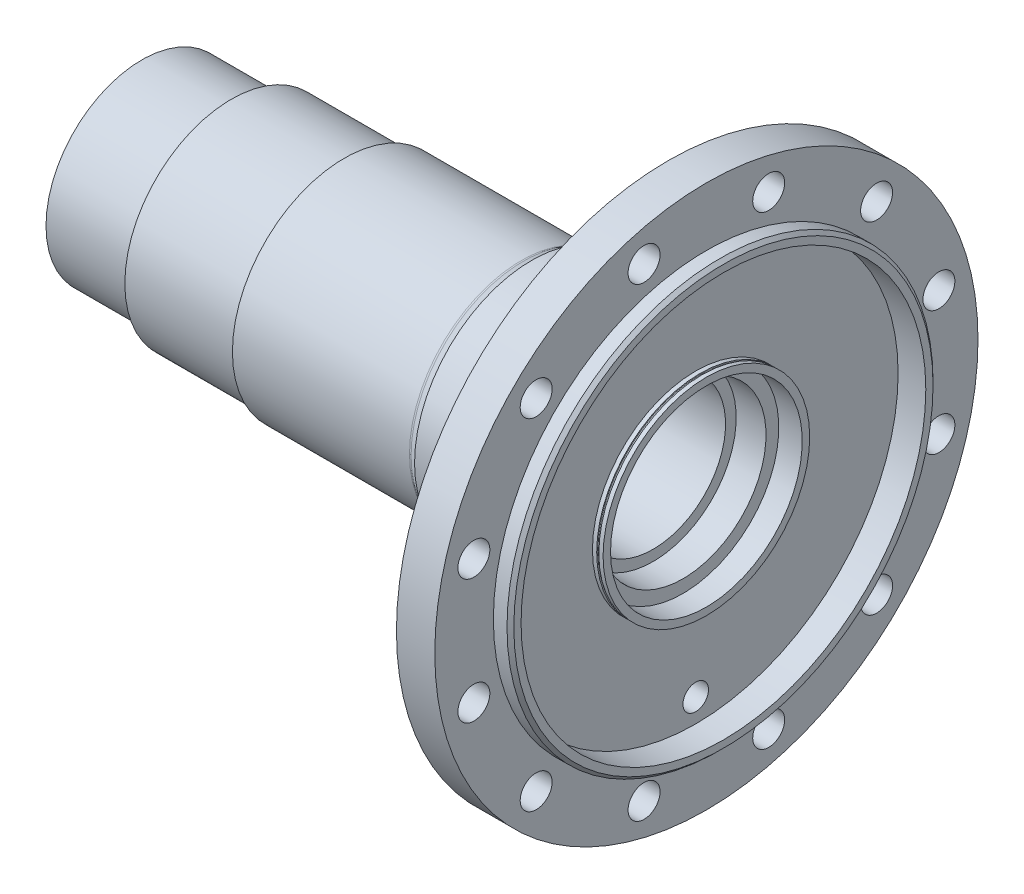
ISO-10303-21;
HEADER;
FILE_DESCRIPTION(('STEP AP214'),'2;1');
FILE_NAME('part.step','',(''),(''),'','','');
FILE_SCHEMA(('AUTOMOTIVE_DESIGN { 1 0 10303 214 1 1 1 1 }'));
ENDSEC;
DATA;
#1=APPLICATION_CONTEXT('core data for automotive mechanical design processes');
#2=APPLICATION_PROTOCOL_DEFINITION('international standard','automotive_design',2000,#1);
#3=PRODUCT_CONTEXT('',#1,'mechanical');
#4=PRODUCT('Part','Part','',(#3));
#5=PRODUCT_RELATED_PRODUCT_CATEGORY('part','',(#4));
#6=PRODUCT_DEFINITION_FORMATION('','',#4);
#7=PRODUCT_DEFINITION_CONTEXT('part definition',#1,'design');
#8=PRODUCT_DEFINITION('design','',#6,#7);
#9=PRODUCT_DEFINITION_SHAPE('','',#8);
#10=(LENGTH_UNIT() NAMED_UNIT(*) SI_UNIT(.MILLI.,.METRE.));
#11=(NAMED_UNIT(*) PLANE_ANGLE_UNIT() SI_UNIT($,.RADIAN.));
#12=(NAMED_UNIT(*) SI_UNIT($,.STERADIAN.) SOLID_ANGLE_UNIT());
#13=UNCERTAINTY_MEASURE_WITH_UNIT(LENGTH_MEASURE(1.E-05),#10,'distance_accuracy_value','');
#14=(GEOMETRIC_REPRESENTATION_CONTEXT(3) GLOBAL_UNCERTAINTY_ASSIGNED_CONTEXT((#13)) GLOBAL_UNIT_ASSIGNED_CONTEXT((#10,
#11,#12)) REPRESENTATION_CONTEXT('',''));
#15=CARTESIAN_POINT('',(0.,0.,0.));
#16=DIRECTION('',(0.,0.,1.));
#17=DIRECTION('',(1.,0.,0.));
#18=AXIS2_PLACEMENT_3D('',#15,#16,#17);
#19=CARTESIAN_POINT('',(265.,45.,0.));
#20=DIRECTION('',(1.,0.,0.));
#21=DIRECTION('',(0.,0.,-1.));
#22=AXIS2_PLACEMENT_3D('',#19,#20,#21);
#23=PLANE('',#22);
#24=CARTESIAN_POINT('',(265.,0.,0.));
#25=DIRECTION('',(-1.,0.,0.));
#26=DIRECTION('',(0.,0.,1.));
#27=AXIS2_PLACEMENT_3D('',#24,#25,#26);
#28=CIRCLE('',#27,45.);
#29=CARTESIAN_POINT('',(265.,0.,45.));
#30=VERTEX_POINT('',#29);
#31=EDGE_CURVE('E219',#30,#30,#28,.T.);
#32=ORIENTED_EDGE('',*,*,#31,.T.);
#33=EDGE_LOOP('',(#32));
#34=FACE_BOUND('',#33,.T.);
#35=CARTESIAN_POINT('',(265.,0.,0.));
#36=DIRECTION('',(-1.,0.,0.));
#37=DIRECTION('',(0.,0.,1.));
#38=AXIS2_PLACEMENT_3D('',#35,#36,#37);
#39=CIRCLE('',#38,48.5);
#40=CARTESIAN_POINT('',(265.,0.,48.5));
#41=VERTEX_POINT('',#40);
#42=EDGE_CURVE('E258',#41,#41,#39,.T.);
#43=ORIENTED_EDGE('',*,*,#42,.F.);
#44=EDGE_LOOP('',(#43));
#45=FACE_BOUND('',#44,.T.);
#46=ADVANCED_FACE('F50',(#34,#45),#23,.T.);
#47=CARTESIAN_POINT('',(0.,0.,0.));
#48=DIRECTION('',(1.,0.,0.));
#49=DIRECTION('',(0.,0.,-1.));
#50=AXIS2_PLACEMENT_3D('',#47,#48,#49);
#51=PLANE('',#50);
#52=CARTESIAN_POINT('',(0.,0.,0.));
#53=DIRECTION('',(-1.,0.,0.));
#54=DIRECTION('',(0.,0.,1.));
#55=AXIS2_PLACEMENT_3D('',#52,#53,#54);
#56=CIRCLE('',#55,31.);
#57=CARTESIAN_POINT('',(0.,0.,31.));
#58=VERTEX_POINT('',#57);
#59=EDGE_CURVE('E180',#58,#58,#56,.T.);
#60=ORIENTED_EDGE('',*,*,#59,.F.);
#61=EDGE_LOOP('',(#60));
#62=FACE_BOUND('',#61,.T.);
#63=CARTESIAN_POINT('',(0.,0.,0.));
#64=DIRECTION('',(-1.,0.,0.));
#65=DIRECTION('',(0.,0.,1.));
#66=AXIS2_PLACEMENT_3D('',#63,#64,#65);
#67=CIRCLE('',#66,45.);
#68=CARTESIAN_POINT('',(0.,0.,45.));
#69=VERTEX_POINT('',#68);
#70=EDGE_CURVE('E175',#69,#69,#67,.T.);
#71=ORIENTED_EDGE('',*,*,#70,.T.);
#72=EDGE_LOOP('',(#71));
#73=FACE_BOUND('',#72,.T.);
#74=ADVANCED_FACE('F52',(#62,#73),#51,.F.);
#75=CARTESIAN_POINT('',(273.,98.4,0.));
#76=DIRECTION('',(-1.,0.,0.));
#77=DIRECTION('',(0.,0.,1.));
#78=AXIS2_PLACEMENT_3D('',#75,#76,#77);
#79=PLANE('',#78);
#80=CARTESIAN_POINT('',(273.,0.,0.));
#81=DIRECTION('',(-1.,0.,0.));
#82=DIRECTION('',(0.,0.,1.));
#83=AXIS2_PLACEMENT_3D('',#80,#81,#82);
#84=CIRCLE('',#83,95.);
#85=CARTESIAN_POINT('',(273.,0.,95.));
#86=VERTEX_POINT('',#85);
#87=EDGE_CURVE('E224',#86,#86,#84,.T.);
#88=ORIENTED_EDGE('',*,*,#87,.T.);
#89=EDGE_LOOP('',(#88));
#90=FACE_BOUND('',#89,.T.);
#91=CARTESIAN_POINT('',(273.,0.,0.));
#92=DIRECTION('',(-1.,0.,0.));
#93=DIRECTION('',(0.,0.,1.));
#94=AXIS2_PLACEMENT_3D('',#91,#92,#93);
#95=CIRCLE('',#94,98.4);
#96=CARTESIAN_POINT('',(273.,0.,98.4));
#97=VERTEX_POINT('',#96);
#98=EDGE_CURVE('E11',#97,#97,#95,.T.);
#99=ORIENTED_EDGE('',*,*,#98,.F.);
#100=EDGE_LOOP('',(#99));
#101=FACE_BOUND('',#100,.T.);
#102=ADVANCED_FACE('F351',(#90,#101),#79,.F.);
#103=CARTESIAN_POINT('',(273.,0.,0.));
#104=DIRECTION('',(-1.,0.,0.));
#105=DIRECTION('',(0.,0.,1.));
#106=AXIS2_PLACEMENT_3D('',#103,#104,#105);
#107=CONICAL_SURFACE('',#106,98.4,0.785398163397435);
#108=CARTESIAN_POINT('',(271.4,0.,0.));
#109=DIRECTION('',(-1.,0.,0.));
#110=DIRECTION('',(0.,0.,1.));
#111=AXIS2_PLACEMENT_3D('',#108,#109,#110);
#112=CIRCLE('',#111,100.);
#113=CARTESIAN_POINT('',(271.4,0.,100.));
#114=VERTEX_POINT('',#113);
#115=EDGE_CURVE('E59',#114,#114,#112,.T.);
#116=ORIENTED_EDGE('',*,*,#115,.F.);
#117=EDGE_LOOP('',(#116));
#118=FACE_BOUND('',#117,.T.);
#119=ORIENTED_EDGE('',*,*,#98,.T.);
#120=EDGE_LOOP('',(#119));
#121=FACE_BOUND('',#120,.T.);
#122=ADVANCED_FACE('F461',(#118,#121),#107,.T.);
#123=CARTESIAN_POINT('',(0.,0.,0.));
#124=DIRECTION('',(-1.,0.,0.));
#125=DIRECTION('',(0.,0.,1.));
#126=AXIS2_PLACEMENT_3D('',#123,#124,#125);
#127=CYLINDRICAL_SURFACE('',#126,100.);
#128=CARTESIAN_POINT('',(265.,0.,0.));
#129=DIRECTION('',(-1.,0.,0.));
#130=DIRECTION('',(0.,0.,1.));
#131=AXIS2_PLACEMENT_3D('',#128,#129,#130);
#132=CIRCLE('',#131,100.);
#133=CARTESIAN_POINT('',(265.,0.,100.));
#134=VERTEX_POINT('',#133);
#135=EDGE_CURVE('E65',#134,#134,#132,.T.);
#136=ORIENTED_EDGE('',*,*,#135,.F.);
#137=EDGE_LOOP('',(#136));
#138=FACE_BOUND('',#137,.T.);
#139=ORIENTED_EDGE('',*,*,#115,.T.);
#140=EDGE_LOOP('',(#139));
#141=FACE_BOUND('',#140,.T.);
#142=ADVANCED_FACE('F457',(#138,#141),#127,.T.);
#143=CARTESIAN_POINT('',(265.,127.5,0.));
#144=DIRECTION('',(-1.,0.,0.));
#145=DIRECTION('',(0.,0.,1.));
#146=AXIS2_PLACEMENT_3D('',#143,#144,#145);
#147=PLANE('',#146);
#148=CARTESIAN_POINT('',(265.,-29.2465520965848,-109.149618370665));
#149=DIRECTION('',(-1.,0.,0.));
#150=DIRECTION('',(0.,0.,1.));
#151=AXIS2_PLACEMENT_3D('',#148,#149,#150);
#152=CIRCLE('',#151,7.50000000000001);
#153=CARTESIAN_POINT('',(265.,-29.2465520965848,-101.649618370665));
#154=VERTEX_POINT('',#153);
#155=EDGE_CURVE('E317',#154,#154,#152,.F.);
#156=ORIENTED_EDGE('',*,*,#155,.F.);
#157=EDGE_LOOP('',(#156));
#158=FACE_BOUND('',#157,.T.);
#159=CARTESIAN_POINT('',(265.,-79.9030662740799,-79.9030662740798));
#160=DIRECTION('',(-1.,0.,0.));
#161=DIRECTION('',(0.,0.,1.));
#162=AXIS2_PLACEMENT_3D('',#159,#160,#161);
#163=CIRCLE('',#162,7.49999999999999);
#164=CARTESIAN_POINT('',(265.,-79.9030662740799,-72.4030662740799));
#165=VERTEX_POINT('',#164);
#166=EDGE_CURVE('E312',#165,#165,#163,.F.);
#167=ORIENTED_EDGE('',*,*,#166,.F.);
#168=EDGE_LOOP('',(#167));
#169=FACE_BOUND('',#168,.T.);
#170=CARTESIAN_POINT('',(265.,-109.149618370665,-29.2465520965849));
#171=DIRECTION('',(-1.,0.,0.));
#172=DIRECTION('',(0.,0.,1.));
#173=AXIS2_PLACEMENT_3D('',#170,#171,#172);
#174=CIRCLE('',#173,7.5);
#175=CARTESIAN_POINT('',(265.,-109.149618370665,-21.7465520965849));
#176=VERTEX_POINT('',#175);
#177=EDGE_CURVE('E307',#176,#176,#174,.F.);
#178=ORIENTED_EDGE('',*,*,#177,.F.);
#179=EDGE_LOOP('',(#178));
#180=FACE_BOUND('',#179,.T.);
#181=CARTESIAN_POINT('',(265.,-109.149618370665,29.2465520965848));
#182=DIRECTION('',(-1.,0.,0.));
#183=DIRECTION('',(0.,0.,1.));
#184=AXIS2_PLACEMENT_3D('',#181,#182,#183);
#185=CIRCLE('',#184,7.5);
#186=CARTESIAN_POINT('',(265.,-109.149618370665,36.7465520965848));
#187=VERTEX_POINT('',#186);
#188=EDGE_CURVE('E302',#187,#187,#185,.F.);
#189=ORIENTED_EDGE('',*,*,#188,.F.);
#190=EDGE_LOOP('',(#189));
#191=FACE_BOUND('',#190,.T.);
#192=CARTESIAN_POINT('',(265.,-79.9030662740799,79.9030662740799));
#193=DIRECTION('',(-1.,0.,0.));
#194=DIRECTION('',(0.,0.,1.));
#195=AXIS2_PLACEMENT_3D('',#192,#193,#194);
#196=CIRCLE('',#195,7.50000000000001);
#197=CARTESIAN_POINT('',(265.,-79.9030662740799,87.4030662740799));
#198=VERTEX_POINT('',#197);
#199=EDGE_CURVE('E297',#198,#198,#196,.F.);
#200=ORIENTED_EDGE('',*,*,#199,.F.);
#201=EDGE_LOOP('',(#200));
#202=FACE_BOUND('',#201,.T.);
#203=CARTESIAN_POINT('',(265.,-29.2465520965848,109.149618370665));
#204=DIRECTION('',(-1.,0.,0.));
#205=DIRECTION('',(0.,0.,1.));
#206=AXIS2_PLACEMENT_3D('',#203,#204,#205);
#207=CIRCLE('',#206,7.50000000000001);
#208=CARTESIAN_POINT('',(265.,-29.2465520965848,116.649618370665));
#209=VERTEX_POINT('',#208);
#210=EDGE_CURVE('E292',#209,#209,#207,.F.);
#211=ORIENTED_EDGE('',*,*,#210,.F.);
#212=EDGE_LOOP('',(#211));
#213=FACE_BOUND('',#212,.T.);
#214=CARTESIAN_POINT('',(265.,29.2465520965849,109.149618370665));
#215=DIRECTION('',(-1.,0.,0.));
#216=DIRECTION('',(0.,0.,1.));
#217=AXIS2_PLACEMENT_3D('',#214,#215,#216);
#218=CIRCLE('',#217,7.49999999999999);
#219=CARTESIAN_POINT('',(265.,29.2465520965849,116.649618370665));
#220=VERTEX_POINT('',#219);
#221=EDGE_CURVE('E287',#220,#220,#218,.F.);
#222=ORIENTED_EDGE('',*,*,#221,.F.);
#223=EDGE_LOOP('',(#222));
#224=FACE_BOUND('',#223,.T.);
#225=CARTESIAN_POINT('',(265.,79.9030662740799,79.9030662740799));
#226=DIRECTION('',(-1.,0.,0.));
#227=DIRECTION('',(0.,0.,1.));
#228=AXIS2_PLACEMENT_3D('',#225,#226,#227);
#229=CIRCLE('',#228,7.50000000000001);
#230=CARTESIAN_POINT('',(265.,79.9030662740799,87.4030662740799));
#231=VERTEX_POINT('',#230);
#232=EDGE_CURVE('E282',#231,#231,#229,.F.);
#233=ORIENTED_EDGE('',*,*,#232,.F.);
#234=EDGE_LOOP('',(#233));
#235=FACE_BOUND('',#234,.T.);
#236=CARTESIAN_POINT('',(265.,109.149618370665,29.2465520965849));
#237=DIRECTION('',(-1.,0.,0.));
#238=DIRECTION('',(0.,0.,1.));
#239=AXIS2_PLACEMENT_3D('',#236,#237,#238);
#240=CIRCLE('',#239,7.5);
#241=CARTESIAN_POINT('',(265.,109.149618370665,36.7465520965848));
#242=VERTEX_POINT('',#241);
#243=EDGE_CURVE('E277',#242,#242,#240,.F.);
#244=ORIENTED_EDGE('',*,*,#243,.F.);
#245=EDGE_LOOP('',(#244));
#246=FACE_BOUND('',#245,.T.);
#247=CARTESIAN_POINT('',(265.,109.149618370665,-29.2465520965848));
#248=DIRECTION('',(-1.,0.,0.));
#249=DIRECTION('',(0.,0.,1.));
#250=AXIS2_PLACEMENT_3D('',#247,#248,#249);
#251=CIRCLE('',#250,7.5);
#252=CARTESIAN_POINT('',(265.,109.149618370665,-21.7465520965848));
#253=VERTEX_POINT('',#252);
#254=EDGE_CURVE('E272',#253,#253,#251,.F.);
#255=ORIENTED_EDGE('',*,*,#254,.F.);
#256=EDGE_LOOP('',(#255));
#257=FACE_BOUND('',#256,.T.);
#258=CARTESIAN_POINT('',(265.,79.9030662740799,-79.9030662740799));
#259=DIRECTION('',(-1.,0.,0.));
#260=DIRECTION('',(0.,0.,1.));
#261=AXIS2_PLACEMENT_3D('',#258,#259,#260);
#262=CIRCLE('',#261,7.49999999999999);
#263=CARTESIAN_POINT('',(265.,79.9030662740799,-72.4030662740799));
#264=VERTEX_POINT('',#263);
#265=EDGE_CURVE('E267',#264,#264,#262,.F.);
#266=ORIENTED_EDGE('',*,*,#265,.F.);
#267=EDGE_LOOP('',(#266));
#268=FACE_BOUND('',#267,.T.);
#269=CARTESIAN_POINT('',(265.,29.2465520965848,-109.149618370665));
#270=DIRECTION('',(-1.,0.,0.));
#271=DIRECTION('',(0.,0.,1.));
#272=AXIS2_PLACEMENT_3D('',#269,#270,#271);
#273=CIRCLE('',#272,7.50000000000001);
#274=CARTESIAN_POINT('',(265.,29.2465520965848,-101.649618370665));
#275=VERTEX_POINT('',#274);
#276=EDGE_CURVE('E263',#275,#275,#273,.F.);
#277=ORIENTED_EDGE('',*,*,#276,.F.);
#278=EDGE_LOOP('',(#277));
#279=FACE_BOUND('',#278,.T.);
#280=CARTESIAN_POINT('',(265.,0.,0.));
#281=DIRECTION('',(-1.,0.,0.));
#282=DIRECTION('',(0.,0.,1.));
#283=AXIS2_PLACEMENT_3D('',#280,#281,#282);
#284=CIRCLE('',#283,127.5);
#285=CARTESIAN_POINT('',(265.,0.,127.5));
#286=VERTEX_POINT('',#285);
#287=EDGE_CURVE('E82',#286,#286,#284,.T.);
#288=ORIENTED_EDGE('',*,*,#287,.F.);
#289=EDGE_LOOP('',(#288));
#290=FACE_BOUND('',#289,.T.);
#291=ORIENTED_EDGE('',*,*,#135,.T.);
#292=EDGE_LOOP('',(#291));
#293=FACE_BOUND('',#292,.T.);
#294=ADVANCED_FACE('F453',(#158,#169,#180,#191,#202,#213,#224,#235,#246,#257,#268,#279,#290,
#293),#147,.F.);
#295=CARTESIAN_POINT('',(0.,0.,0.));
#296=DIRECTION('',(-1.,0.,0.));
#297=DIRECTION('',(0.,0.,1.));
#298=AXIS2_PLACEMENT_3D('',#295,#296,#297);
#299=CYLINDRICAL_SURFACE('',#298,127.5);
#300=CARTESIAN_POINT('',(247.,0.,0.));
#301=DIRECTION('',(-1.,0.,0.));
#302=DIRECTION('',(0.,0.,1.));
#303=AXIS2_PLACEMENT_3D('',#300,#301,#302);
#304=CIRCLE('',#303,127.5);
#305=CARTESIAN_POINT('',(247.,0.,127.5));
#306=VERTEX_POINT('',#305);
#307=EDGE_CURVE('E87',#306,#306,#304,.T.);
#308=ORIENTED_EDGE('',*,*,#307,.F.);
#309=EDGE_LOOP('',(#308));
#310=FACE_BOUND('',#309,.T.);
#311=ORIENTED_EDGE('',*,*,#287,.T.);
#312=EDGE_LOOP('',(#311));
#313=FACE_BOUND('',#312,.T.);
#314=ADVANCED_FACE('F449',(#310,#313),#299,.T.);
#315=CARTESIAN_POINT('',(247.,100.,0.));
#316=DIRECTION('',(1.,0.,0.));
#317=DIRECTION('',(0.,0.,-1.));
#318=AXIS2_PLACEMENT_3D('',#315,#316,#317);
#319=PLANE('',#318);
#320=CARTESIAN_POINT('',(247.,-29.2465520965848,-109.149618370665));
#321=DIRECTION('',(1.,0.,0.));
#322=DIRECTION('',(0.,0.,-1.));
#323=AXIS2_PLACEMENT_3D('',#320,#321,#322);
#324=CIRCLE('',#323,7.50000000000001);
#325=CARTESIAN_POINT('',(247.,-29.2465520965848,-116.649618370665));
#326=VERTEX_POINT('',#325);
#327=EDGE_CURVE('E321',#326,#326,#324,.F.);
#328=ORIENTED_EDGE('',*,*,#327,.F.);
#329=EDGE_LOOP('',(#328));
#330=FACE_BOUND('',#329,.T.);
#331=CARTESIAN_POINT('',(247.,-79.9030662740799,-79.9030662740798));
#332=DIRECTION('',(1.,0.,0.));
#333=DIRECTION('',(0.,0.,-1.));
#334=AXIS2_PLACEMENT_3D('',#331,#332,#333);
#335=CIRCLE('',#334,7.49999999999999);
#336=CARTESIAN_POINT('',(247.,-79.9030662740799,-87.4030662740798));
#337=VERTEX_POINT('',#336);
#338=EDGE_CURVE('E316',#337,#337,#335,.F.);
#339=ORIENTED_EDGE('',*,*,#338,.F.);
#340=EDGE_LOOP('',(#339));
#341=FACE_BOUND('',#340,.T.);
#342=CARTESIAN_POINT('',(247.,-109.149618370665,-29.2465520965849));
#343=DIRECTION('',(1.,0.,0.));
#344=DIRECTION('',(0.,0.,-1.));
#345=AXIS2_PLACEMENT_3D('',#342,#343,#344);
#346=CIRCLE('',#345,7.5);
#347=CARTESIAN_POINT('',(247.,-109.149618370665,-36.7465520965849));
#348=VERTEX_POINT('',#347);
#349=EDGE_CURVE('E311',#348,#348,#346,.F.);
#350=ORIENTED_EDGE('',*,*,#349,.F.);
#351=EDGE_LOOP('',(#350));
#352=FACE_BOUND('',#351,.T.);
#353=CARTESIAN_POINT('',(247.,-109.149618370665,29.2465520965848));
#354=DIRECTION('',(1.,0.,0.));
#355=DIRECTION('',(0.,0.,-1.));
#356=AXIS2_PLACEMENT_3D('',#353,#354,#355);
#357=CIRCLE('',#356,7.5);
#358=CARTESIAN_POINT('',(247.,-109.149618370665,21.7465520965848));
#359=VERTEX_POINT('',#358);
#360=EDGE_CURVE('E306',#359,#359,#357,.F.);
#361=ORIENTED_EDGE('',*,*,#360,.F.);
#362=EDGE_LOOP('',(#361));
#363=FACE_BOUND('',#362,.T.);
#364=CARTESIAN_POINT('',(247.,-79.9030662740799,79.9030662740799));
#365=DIRECTION('',(1.,0.,0.));
#366=DIRECTION('',(0.,0.,-1.));
#367=AXIS2_PLACEMENT_3D('',#364,#365,#366);
#368=CIRCLE('',#367,7.50000000000001);
#369=CARTESIAN_POINT('',(247.,-79.9030662740799,72.4030662740799));
#370=VERTEX_POINT('',#369);
#371=EDGE_CURVE('E301',#370,#370,#368,.F.);
#372=ORIENTED_EDGE('',*,*,#371,.F.);
#373=EDGE_LOOP('',(#372));
#374=FACE_BOUND('',#373,.T.);
#375=CARTESIAN_POINT('',(247.,-29.2465520965848,109.149618370665));
#376=DIRECTION('',(1.,0.,0.));
#377=DIRECTION('',(0.,0.,-1.));
#378=AXIS2_PLACEMENT_3D('',#375,#376,#377);
#379=CIRCLE('',#378,7.50000000000001);
#380=CARTESIAN_POINT('',(247.,-29.2465520965848,101.649618370665));
#381=VERTEX_POINT('',#380);
#382=EDGE_CURVE('E296',#381,#381,#379,.F.);
#383=ORIENTED_EDGE('',*,*,#382,.F.);
#384=EDGE_LOOP('',(#383));
#385=FACE_BOUND('',#384,.T.);
#386=CARTESIAN_POINT('',(247.,29.2465520965849,109.149618370665));
#387=DIRECTION('',(1.,0.,0.));
#388=DIRECTION('',(0.,0.,-1.));
#389=AXIS2_PLACEMENT_3D('',#386,#387,#388);
#390=CIRCLE('',#389,7.49999999999999);
#391=CARTESIAN_POINT('',(247.,29.2465520965849,101.649618370665));
#392=VERTEX_POINT('',#391);
#393=EDGE_CURVE('E291',#392,#392,#390,.F.);
#394=ORIENTED_EDGE('',*,*,#393,.F.);
#395=EDGE_LOOP('',(#394));
#396=FACE_BOUND('',#395,.T.);
#397=CARTESIAN_POINT('',(247.,79.9030662740799,79.9030662740799));
#398=DIRECTION('',(1.,0.,0.));
#399=DIRECTION('',(0.,0.,-1.));
#400=AXIS2_PLACEMENT_3D('',#397,#398,#399);
#401=CIRCLE('',#400,7.50000000000001);
#402=CARTESIAN_POINT('',(247.,79.9030662740799,72.4030662740799));
#403=VERTEX_POINT('',#402);
#404=EDGE_CURVE('E286',#403,#403,#401,.F.);
#405=ORIENTED_EDGE('',*,*,#404,.F.);
#406=EDGE_LOOP('',(#405));
#407=FACE_BOUND('',#406,.T.);
#408=CARTESIAN_POINT('',(247.,109.149618370665,29.2465520965849));
#409=DIRECTION('',(1.,0.,0.));
#410=DIRECTION('',(0.,0.,-1.));
#411=AXIS2_PLACEMENT_3D('',#408,#409,#410);
#412=CIRCLE('',#411,7.5);
#413=CARTESIAN_POINT('',(247.,109.149618370665,21.7465520965849));
#414=VERTEX_POINT('',#413);
#415=EDGE_CURVE('E281',#414,#414,#412,.F.);
#416=ORIENTED_EDGE('',*,*,#415,.F.);
#417=EDGE_LOOP('',(#416));
#418=FACE_BOUND('',#417,.T.);
#419=CARTESIAN_POINT('',(247.,109.149618370665,-29.2465520965848));
#420=DIRECTION('',(1.,0.,0.));
#421=DIRECTION('',(0.,0.,-1.));
#422=AXIS2_PLACEMENT_3D('',#419,#420,#421);
#423=CIRCLE('',#422,7.5);
#424=CARTESIAN_POINT('',(247.,109.149618370665,-36.7465520965848));
#425=VERTEX_POINT('',#424);
#426=EDGE_CURVE('E276',#425,#425,#423,.F.);
#427=ORIENTED_EDGE('',*,*,#426,.F.);
#428=EDGE_LOOP('',(#427));
#429=FACE_BOUND('',#428,.T.);
#430=CARTESIAN_POINT('',(247.,79.9030662740799,-79.9030662740799));
#431=DIRECTION('',(1.,0.,0.));
#432=DIRECTION('',(0.,0.,-1.));
#433=AXIS2_PLACEMENT_3D('',#430,#431,#432);
#434=CIRCLE('',#433,7.49999999999999);
#435=CARTESIAN_POINT('',(247.,79.9030662740799,-87.4030662740799));
#436=VERTEX_POINT('',#435);
#437=EDGE_CURVE('E271',#436,#436,#434,.F.);
#438=ORIENTED_EDGE('',*,*,#437,.F.);
#439=EDGE_LOOP('',(#438));
#440=FACE_BOUND('',#439,.T.);
#441=CARTESIAN_POINT('',(247.,29.2465520965848,-109.149618370665));
#442=DIRECTION('',(1.,0.,0.));
#443=DIRECTION('',(0.,0.,-1.));
#444=AXIS2_PLACEMENT_3D('',#441,#442,#443);
#445=CIRCLE('',#444,7.50000000000001);
#446=CARTESIAN_POINT('',(247.,29.2465520965848,-116.649618370665));
#447=VERTEX_POINT('',#446);
#448=EDGE_CURVE('E71',#447,#447,#445,.F.);
#449=ORIENTED_EDGE('',*,*,#448,.F.);
#450=EDGE_LOOP('',(#449));
#451=FACE_BOUND('',#450,.T.);
#452=CARTESIAN_POINT('',(247.,0.,0.));
#453=DIRECTION('',(-1.,0.,0.));
#454=DIRECTION('',(0.,0.,1.));
#455=AXIS2_PLACEMENT_3D('',#452,#453,#454);
#456=CIRCLE('',#455,100.);
#457=CARTESIAN_POINT('',(247.,0.,100.));
#458=VERTEX_POINT('',#457);
#459=EDGE_CURVE('E92',#458,#458,#456,.T.);
#460=ORIENTED_EDGE('',*,*,#459,.F.);
#461=EDGE_LOOP('',(#460));
#462=FACE_BOUND('',#461,.T.);
#463=ORIENTED_EDGE('',*,*,#307,.T.);
#464=EDGE_LOOP('',(#463));
#465=FACE_BOUND('',#464,.T.);
#466=ADVANCED_FACE('F445',(#330,#341,#352,#363,#374,#385,#396,#407,#418,#429,#440,#451,#462,
#465),#319,.F.);
#467=CARTESIAN_POINT('',(0.,0.,0.));
#468=DIRECTION('',(-1.,0.,0.));
#469=DIRECTION('',(0.,0.,1.));
#470=AXIS2_PLACEMENT_3D('',#467,#468,#469);
#471=CYLINDRICAL_SURFACE('',#470,100.);
#472=CARTESIAN_POINT('',(239.,0.,0.));
#473=DIRECTION('',(-1.,0.,0.));
#474=DIRECTION('',(0.,0.,1.));
#475=AXIS2_PLACEMENT_3D('',#472,#473,#474);
#476=CIRCLE('',#475,100.);
#477=CARTESIAN_POINT('',(239.,0.,100.));
#478=VERTEX_POINT('',#477);
#479=EDGE_CURVE('E100',#478,#478,#476,.T.);
#480=ORIENTED_EDGE('',*,*,#479,.F.);
#481=EDGE_LOOP('',(#480));
#482=FACE_BOUND('',#481,.T.);
#483=ORIENTED_EDGE('',*,*,#459,.T.);
#484=EDGE_LOOP('',(#483));
#485=FACE_BOUND('',#484,.T.);
#486=ADVANCED_FACE('F441',(#482,#485),#471,.T.);
#487=CARTESIAN_POINT('',(239.,64.5,0.));
#488=DIRECTION('',(1.,0.,0.));
#489=DIRECTION('',(0.,0.,-1.));
#490=AXIS2_PLACEMENT_3D('',#487,#488,#489);
#491=PLANE('',#490);
#492=CARTESIAN_POINT('',(239.,-84.,0.));
#493=DIRECTION('',(1.,0.,0.));
#494=DIRECTION('',(0.,0.,-1.));
#495=AXIS2_PLACEMENT_3D('',#492,#493,#494);
#496=CIRCLE('',#495,6.);
#497=CARTESIAN_POINT('',(239.,-84.,-6.));
#498=VERTEX_POINT('',#497);
#499=EDGE_CURVE('E322',#498,#498,#496,.F.);
#500=ORIENTED_EDGE('',*,*,#499,.F.);
#501=EDGE_LOOP('',(#500));
#502=FACE_BOUND('',#501,.T.);
#503=CARTESIAN_POINT('',(239.,0.,0.));
#504=DIRECTION('',(-1.,0.,0.));
#505=DIRECTION('',(0.,0.,1.));
#506=AXIS2_PLACEMENT_3D('',#503,#504,#505);
#507=CIRCLE('',#506,64.5);
#508=CARTESIAN_POINT('',(239.,0.,64.5));
#509=VERTEX_POINT('',#508);
#510=EDGE_CURVE('E104',#509,#509,#507,.T.);
#511=ORIENTED_EDGE('',*,*,#510,.F.);
#512=EDGE_LOOP('',(#511));
#513=FACE_BOUND('',#512,.T.);
#514=ORIENTED_EDGE('',*,*,#479,.T.);
#515=EDGE_LOOP('',(#514));
#516=FACE_BOUND('',#515,.T.);
#517=ADVANCED_FACE('F437',(#502,#513,#516),#491,.F.);
#518=CARTESIAN_POINT('',(237.,0.,0.));
#519=DIRECTION('',(-1.,0.,0.));
#520=DIRECTION('',(0.,0.,1.));
#521=AXIS2_PLACEMENT_3D('',#518,#519,#520);
#522=TOROIDAL_SURFACE('',#521,64.5,1.99999999999997);
#523=CARTESIAN_POINT('',(237.,0.,0.));
#524=DIRECTION('',(-1.,0.,0.));
#525=DIRECTION('',(0.,0.,1.));
#526=AXIS2_PLACEMENT_3D('',#523,#524,#525);
#527=CIRCLE('',#526,62.5);
#528=CARTESIAN_POINT('',(237.,0.,62.5));
#529=VERTEX_POINT('',#528);
#530=EDGE_CURVE('E109',#529,#529,#527,.T.);
#531=ORIENTED_EDGE('',*,*,#530,.F.);
#532=EDGE_LOOP('',(#531));
#533=FACE_BOUND('',#532,.T.);
#534=ORIENTED_EDGE('',*,*,#510,.T.);
#535=EDGE_LOOP('',(#534));
#536=FACE_BOUND('',#535,.T.);
#537=ADVANCED_FACE('F433',(#533,#536),#522,.F.);
#538=CARTESIAN_POINT('',(0.,0.,0.));
#539=DIRECTION('',(-1.,0.,0.));
#540=DIRECTION('',(0.,0.,1.));
#541=AXIS2_PLACEMENT_3D('',#538,#539,#540);
#542=CYLINDRICAL_SURFACE('',#541,62.5);
#543=CARTESIAN_POINT('',(218.,0.,0.));
#544=DIRECTION('',(-1.,0.,0.));
#545=DIRECTION('',(0.,0.,1.));
#546=AXIS2_PLACEMENT_3D('',#543,#544,#545);
#547=CIRCLE('',#546,62.5);
#548=CARTESIAN_POINT('',(218.,0.,62.5));
#549=VERTEX_POINT('',#548);
#550=EDGE_CURVE('E114',#549,#549,#547,.T.);
#551=ORIENTED_EDGE('',*,*,#550,.F.);
#552=EDGE_LOOP('',(#551));
#553=FACE_BOUND('',#552,.T.);
#554=ORIENTED_EDGE('',*,*,#530,.T.);
#555=EDGE_LOOP('',(#554));
#556=FACE_BOUND('',#555,.T.);
#557=ADVANCED_FACE('F429',(#553,#556),#542,.T.);
#558=CARTESIAN_POINT('',(218.,0.,0.));
#559=DIRECTION('',(1.,0.,0.));
#560=DIRECTION('',(0.,0.,-1.));
#561=AXIS2_PLACEMENT_3D('',#558,#559,#560);
#562=CONICAL_SURFACE('',#561,62.5,0.523598775598297);
#563=CARTESIAN_POINT('',(215.,0.,0.));
#564=DIRECTION('',(-1.,0.,0.));
#565=DIRECTION('',(0.,0.,1.));
#566=AXIS2_PLACEMENT_3D('',#563,#564,#565);
#567=CIRCLE('',#566,60.7679491924311);
#568=CARTESIAN_POINT('',(215.,0.,60.7679491924311));
#569=VERTEX_POINT('',#568);
#570=EDGE_CURVE('E122',#569,#569,#567,.T.);
#571=ORIENTED_EDGE('',*,*,#570,.F.);
#572=EDGE_LOOP('',(#571));
#573=FACE_BOUND('',#572,.T.);
#574=ORIENTED_EDGE('',*,*,#550,.T.);
#575=EDGE_LOOP('',(#574));
#576=FACE_BOUND('',#575,.T.);
#577=ADVANCED_FACE('F425',(#573,#576),#562,.T.);
#578=CARTESIAN_POINT('',(215.,57.,0.));
#579=DIRECTION('',(1.,0.,0.));
#580=DIRECTION('',(0.,0.,-1.));
#581=AXIS2_PLACEMENT_3D('',#578,#579,#580);
#582=PLANE('',#581);
#583=CARTESIAN_POINT('',(215.,0.,0.));
#584=DIRECTION('',(-1.,0.,0.));
#585=DIRECTION('',(0.,0.,1.));
#586=AXIS2_PLACEMENT_3D('',#583,#584,#585);
#587=CIRCLE('',#586,57.);
#588=CARTESIAN_POINT('',(215.,0.,57.));
#589=VERTEX_POINT('',#588);
#590=EDGE_CURVE('E126',#589,#589,#587,.T.);
#591=ORIENTED_EDGE('',*,*,#590,.F.);
#592=EDGE_LOOP('',(#591));
#593=FACE_BOUND('',#592,.T.);
#594=ORIENTED_EDGE('',*,*,#570,.T.);
#595=EDGE_LOOP('',(#594));
#596=FACE_BOUND('',#595,.T.);
#597=ADVANCED_FACE('F421',(#593,#596),#582,.F.);
#598=CARTESIAN_POINT('',(213.,0.,0.));
#599=DIRECTION('',(-1.,0.,0.));
#600=DIRECTION('',(0.,0.,1.));
#601=AXIS2_PLACEMENT_3D('',#598,#599,#600);
#602=TOROIDAL_SURFACE('',#601,57.,1.99999999999997);
#603=CARTESIAN_POINT('',(213.,0.,0.));
#604=DIRECTION('',(-1.,0.,0.));
#605=DIRECTION('',(0.,0.,1.));
#606=AXIS2_PLACEMENT_3D('',#603,#604,#605);
#607=CIRCLE('',#606,55.);
#608=CARTESIAN_POINT('',(213.,0.,55.));
#609=VERTEX_POINT('',#608);
#610=EDGE_CURVE('E131',#609,#609,#607,.T.);
#611=ORIENTED_EDGE('',*,*,#610,.F.);
#612=EDGE_LOOP('',(#611));
#613=FACE_BOUND('',#612,.T.);
#614=ORIENTED_EDGE('',*,*,#590,.T.);
#615=EDGE_LOOP('',(#614));
#616=FACE_BOUND('',#615,.T.);
#617=ADVANCED_FACE('F417',(#613,#616),#602,.F.);
#618=CARTESIAN_POINT('',(0.,0.,0.));
#619=DIRECTION('',(-1.,0.,0.));
#620=DIRECTION('',(0.,0.,1.));
#621=AXIS2_PLACEMENT_3D('',#618,#619,#620);
#622=CYLINDRICAL_SURFACE('',#621,55.);
#623=CARTESIAN_POINT('',(183.,0.,0.));
#624=DIRECTION('',(-1.,0.,0.));
#625=DIRECTION('',(0.,0.,1.));
#626=AXIS2_PLACEMENT_3D('',#623,#624,#625);
#627=CIRCLE('',#626,55.);
#628=CARTESIAN_POINT('',(183.,0.,55.));
#629=VERTEX_POINT('',#628);
#630=EDGE_CURVE('E136',#629,#629,#627,.T.);
#631=ORIENTED_EDGE('',*,*,#630,.F.);
#632=EDGE_LOOP('',(#631));
#633=FACE_BOUND('',#632,.T.);
#634=ORIENTED_EDGE('',*,*,#610,.T.);
#635=EDGE_LOOP('',(#634));
#636=FACE_BOUND('',#635,.T.);
#637=ADVANCED_FACE('F413',(#633,#636),#622,.T.);
#638=CARTESIAN_POINT('',(183.,0.,0.));
#639=DIRECTION('',(1.,0.,0.));
#640=DIRECTION('',(0.,0.,-1.));
#641=AXIS2_PLACEMENT_3D('',#638,#639,#640);
#642=CONICAL_SURFACE('',#641,55.,0.5235987755983);
#643=CARTESIAN_POINT('',(179.133974596216,0.,0.));
#644=DIRECTION('',(-1.,0.,0.));
#645=DIRECTION('',(0.,0.,1.));
#646=AXIS2_PLACEMENT_3D('',#643,#644,#645);
#647=CIRCLE('',#646,52.7679491924311);
#648=CARTESIAN_POINT('',(179.133974596216,0.,52.7679491924311));
#649=VERTEX_POINT('',#648);
#650=EDGE_CURVE('E144',#649,#649,#647,.T.);
#651=ORIENTED_EDGE('',*,*,#650,.F.);
#652=EDGE_LOOP('',(#651));
#653=FACE_BOUND('',#652,.T.);
#654=ORIENTED_EDGE('',*,*,#630,.T.);
#655=EDGE_LOOP('',(#654));
#656=FACE_BOUND('',#655,.T.);
#657=ADVANCED_FACE('F409',(#653,#656),#642,.T.);
#658=CARTESIAN_POINT('',(178.133974596216,0.,0.));
#659=DIRECTION('',(-1.,0.,0.));
#660=DIRECTION('',(0.,0.,1.));
#661=AXIS2_PLACEMENT_3D('',#658,#659,#660);
#662=TOROIDAL_SURFACE('',#661,54.4999999999999,1.99999999999991);
#663=CARTESIAN_POINT('',(178.133974596216,0.,0.));
#664=DIRECTION('',(-1.,0.,0.));
#665=DIRECTION('',(0.,0.,1.));
#666=AXIS2_PLACEMENT_3D('',#663,#664,#665);
#667=CIRCLE('',#666,52.5);
#668=CARTESIAN_POINT('',(178.133974596216,0.,52.5));
#669=VERTEX_POINT('',#668);
#670=EDGE_CURVE('E148',#669,#669,#667,.T.);
#671=ORIENTED_EDGE('',*,*,#670,.F.);
#672=EDGE_LOOP('',(#671));
#673=FACE_BOUND('',#672,.T.);
#674=ORIENTED_EDGE('',*,*,#650,.T.);
#675=EDGE_LOOP('',(#674));
#676=FACE_BOUND('',#675,.T.);
#677=ADVANCED_FACE('F405',(#673,#676),#662,.F.);
#678=CARTESIAN_POINT('',(0.,0.,0.));
#679=DIRECTION('',(-1.,0.,0.));
#680=DIRECTION('',(0.,0.,1.));
#681=AXIS2_PLACEMENT_3D('',#678,#679,#680);
#682=CYLINDRICAL_SURFACE('',#681,52.5);
#683=CARTESIAN_POINT('',(95.,0.,0.));
#684=DIRECTION('',(-1.,0.,0.));
#685=DIRECTION('',(0.,0.,1.));
#686=AXIS2_PLACEMENT_3D('',#683,#684,#685);
#687=CIRCLE('',#686,52.5);
#688=CARTESIAN_POINT('',(95.,0.,52.5));
#689=VERTEX_POINT('',#688);
#690=EDGE_CURVE('E153',#689,#689,#687,.T.);
#691=ORIENTED_EDGE('',*,*,#690,.F.);
#692=EDGE_LOOP('',(#691));
#693=FACE_BOUND('',#692,.T.);
#694=ORIENTED_EDGE('',*,*,#670,.T.);
#695=EDGE_LOOP('',(#694));
#696=FACE_BOUND('',#695,.T.);
#697=ADVANCED_FACE('F401',(#693,#696),#682,.T.);
#698=CARTESIAN_POINT('',(95.,50.,0.));
#699=DIRECTION('',(1.,0.,0.));
#700=DIRECTION('',(0.,0.,-1.));
#701=AXIS2_PLACEMENT_3D('',#698,#699,#700);
#702=PLANE('',#701);
#703=CARTESIAN_POINT('',(95.,0.,0.));
#704=DIRECTION('',(-1.,0.,0.));
#705=DIRECTION('',(0.,0.,1.));
#706=AXIS2_PLACEMENT_3D('',#703,#704,#705);
#707=CIRCLE('',#706,50.);
#708=CARTESIAN_POINT('',(95.,0.,50.));
#709=VERTEX_POINT('',#708);
#710=EDGE_CURVE('E158',#709,#709,#707,.T.);
#711=ORIENTED_EDGE('',*,*,#710,.F.);
#712=EDGE_LOOP('',(#711));
#713=FACE_BOUND('',#712,.T.);
#714=ORIENTED_EDGE('',*,*,#690,.T.);
#715=EDGE_LOOP('',(#714));
#716=FACE_BOUND('',#715,.T.);
#717=ADVANCED_FACE('F397',(#713,#716),#702,.F.);
#718=CARTESIAN_POINT('',(0.,0.,0.));
#719=DIRECTION('',(-1.,0.,0.));
#720=DIRECTION('',(0.,0.,1.));
#721=AXIS2_PLACEMENT_3D('',#718,#719,#720);
#722=CYLINDRICAL_SURFACE('',#721,50.);
#723=CARTESIAN_POINT('',(42.,0.,0.));
#724=DIRECTION('',(-1.,0.,0.));
#725=DIRECTION('',(0.,0.,1.));
#726=AXIS2_PLACEMENT_3D('',#723,#724,#725);
#727=CIRCLE('',#726,50.);
#728=CARTESIAN_POINT('',(42.,0.,50.));
#729=VERTEX_POINT('',#728);
#730=EDGE_CURVE('E166',#729,#729,#727,.T.);
#731=ORIENTED_EDGE('',*,*,#730,.F.);
#732=EDGE_LOOP('',(#731));
#733=FACE_BOUND('',#732,.T.);
#734=ORIENTED_EDGE('',*,*,#710,.T.);
#735=EDGE_LOOP('',(#734));
#736=FACE_BOUND('',#735,.T.);
#737=ADVANCED_FACE('F393',(#733,#736),#722,.T.);
#738=CARTESIAN_POINT('',(42.,45.,0.));
#739=DIRECTION('',(1.,0.,0.));
#740=DIRECTION('',(0.,0.,-1.));
#741=AXIS2_PLACEMENT_3D('',#738,#739,#740);
#742=PLANE('',#741);
#743=CARTESIAN_POINT('',(42.,0.,0.));
#744=DIRECTION('',(-1.,0.,0.));
#745=DIRECTION('',(0.,0.,1.));
#746=AXIS2_PLACEMENT_3D('',#743,#744,#745);
#747=CIRCLE('',#746,45.);
#748=CARTESIAN_POINT('',(42.,0.,45.));
#749=VERTEX_POINT('',#748);
#750=EDGE_CURVE('E170',#749,#749,#747,.T.);
#751=ORIENTED_EDGE('',*,*,#750,.F.);
#752=EDGE_LOOP('',(#751));
#753=FACE_BOUND('',#752,.T.);
#754=ORIENTED_EDGE('',*,*,#730,.T.);
#755=EDGE_LOOP('',(#754));
#756=FACE_BOUND('',#755,.T.);
#757=ADVANCED_FACE('F389',(#753,#756),#742,.F.);
#758=CARTESIAN_POINT('',(0.,0.,0.));
#759=DIRECTION('',(-1.,0.,0.));
#760=DIRECTION('',(0.,0.,1.));
#761=AXIS2_PLACEMENT_3D('',#758,#759,#760);
#762=CYLINDRICAL_SURFACE('',#761,45.);
#763=ORIENTED_EDGE('',*,*,#70,.F.);
#764=EDGE_LOOP('',(#763));
#765=FACE_BOUND('',#764,.T.);
#766=ORIENTED_EDGE('',*,*,#750,.T.);
#767=EDGE_LOOP('',(#766));
#768=FACE_BOUND('',#767,.T.);
#769=ADVANCED_FACE('F385',(#765,#768),#762,.T.);
#770=CARTESIAN_POINT('',(0.,0.,0.));
#771=DIRECTION('',(-1.,0.,0.));
#772=DIRECTION('',(0.,0.,1.));
#773=AXIS2_PLACEMENT_3D('',#770,#771,#772);
#774=CYLINDRICAL_SURFACE('',#773,31.);
#775=ORIENTED_EDGE('',*,*,#59,.T.);
#776=EDGE_LOOP('',(#775));
#777=FACE_BOUND('',#776,.T.);
#778=CARTESIAN_POINT('',(203.5,0.,0.));
#779=DIRECTION('',(-1.,0.,0.));
#780=DIRECTION('',(0.,0.,1.));
#781=AXIS2_PLACEMENT_3D('',#778,#779,#780);
#782=CIRCLE('',#781,31.);
#783=CARTESIAN_POINT('',(203.5,0.,31.));
#784=VERTEX_POINT('',#783);
#785=EDGE_CURVE('E188',#784,#784,#782,.T.);
#786=ORIENTED_EDGE('',*,*,#785,.F.);
#787=EDGE_LOOP('',(#786));
#788=FACE_BOUND('',#787,.T.);
#789=ADVANCED_FACE('F381',(#777,#788),#774,.F.);
#790=CARTESIAN_POINT('',(203.5,31.,0.));
#791=DIRECTION('',(1.,0.,0.));
#792=DIRECTION('',(0.,0.,-1.));
#793=AXIS2_PLACEMENT_3D('',#790,#791,#792);
#794=PLANE('',#793);
#795=ORIENTED_EDGE('',*,*,#785,.T.);
#796=EDGE_LOOP('',(#795));
#797=FACE_BOUND('',#796,.T.);
#798=CARTESIAN_POINT('',(203.5,0.,0.));
#799=DIRECTION('',(-1.,0.,0.));
#800=DIRECTION('',(0.,0.,1.));
#801=AXIS2_PLACEMENT_3D('',#798,#799,#800);
#802=CIRCLE('',#801,34.);
#803=CARTESIAN_POINT('',(203.5,0.,34.));
#804=VERTEX_POINT('',#803);
#805=EDGE_CURVE('E192',#804,#804,#802,.T.);
#806=ORIENTED_EDGE('',*,*,#805,.F.);
#807=EDGE_LOOP('',(#806));
#808=FACE_BOUND('',#807,.T.);
#809=ADVANCED_FACE('F377',(#797,#808),#794,.T.);
#810=CARTESIAN_POINT('',(0.,0.,0.));
#811=DIRECTION('',(-1.,0.,0.));
#812=DIRECTION('',(0.,0.,1.));
#813=AXIS2_PLACEMENT_3D('',#810,#811,#812);
#814=CYLINDRICAL_SURFACE('',#813,34.);
#815=ORIENTED_EDGE('',*,*,#805,.T.);
#816=EDGE_LOOP('',(#815));
#817=FACE_BOUND('',#816,.T.);
#818=CARTESIAN_POINT('',(240.,0.,0.));
#819=DIRECTION('',(-1.,0.,0.));
#820=DIRECTION('',(0.,0.,1.));
#821=AXIS2_PLACEMENT_3D('',#818,#819,#820);
#822=CIRCLE('',#821,34.);
#823=CARTESIAN_POINT('',(240.,0.,34.));
#824=VERTEX_POINT('',#823);
#825=EDGE_CURVE('E197',#824,#824,#822,.T.);
#826=ORIENTED_EDGE('',*,*,#825,.F.);
#827=EDGE_LOOP('',(#826));
#828=FACE_BOUND('',#827,.T.);
#829=ADVANCED_FACE('F373',(#817,#828),#814,.F.);
#830=CARTESIAN_POINT('',(240.,34.,0.));
#831=DIRECTION('',(1.,0.,0.));
#832=DIRECTION('',(0.,0.,-1.));
#833=AXIS2_PLACEMENT_3D('',#830,#831,#832);
#834=PLANE('',#833);
#835=ORIENTED_EDGE('',*,*,#825,.T.);
#836=EDGE_LOOP('',(#835));
#837=FACE_BOUND('',#836,.T.);
#838=CARTESIAN_POINT('',(240.,0.,0.));
#839=DIRECTION('',(-1.,0.,0.));
#840=DIRECTION('',(0.,0.,1.));
#841=AXIS2_PLACEMENT_3D('',#838,#839,#840);
#842=CIRCLE('',#841,39.);
#843=CARTESIAN_POINT('',(240.,0.,39.));
#844=VERTEX_POINT('',#843);
#845=EDGE_CURVE('E202',#844,#844,#842,.T.);
#846=ORIENTED_EDGE('',*,*,#845,.F.);
#847=EDGE_LOOP('',(#846));
#848=FACE_BOUND('',#847,.T.);
#849=ADVANCED_FACE('F369',(#837,#848),#834,.T.);
#850=CARTESIAN_POINT('',(0.,0.,0.));
#851=DIRECTION('',(-1.,0.,0.));
#852=DIRECTION('',(0.,0.,1.));
#853=AXIS2_PLACEMENT_3D('',#850,#851,#852);
#854=CYLINDRICAL_SURFACE('',#853,39.);
#855=ORIENTED_EDGE('',*,*,#845,.T.);
#856=EDGE_LOOP('',(#855));
#857=FACE_BOUND('',#856,.T.);
#858=CARTESIAN_POINT('',(254.,0.,0.));
#859=DIRECTION('',(-1.,0.,0.));
#860=DIRECTION('',(0.,0.,1.));
#861=AXIS2_PLACEMENT_3D('',#858,#859,#860);
#862=CIRCLE('',#861,39.);
#863=CARTESIAN_POINT('',(254.,0.,39.));
#864=VERTEX_POINT('',#863);
#865=EDGE_CURVE('E210',#864,#864,#862,.T.);
#866=ORIENTED_EDGE('',*,*,#865,.F.);
#867=EDGE_LOOP('',(#866));
#868=FACE_BOUND('',#867,.T.);
#869=ADVANCED_FACE('F365',(#857,#868),#854,.F.);
#870=CARTESIAN_POINT('',(254.,39.,0.));
#871=DIRECTION('',(1.,0.,0.));
#872=DIRECTION('',(0.,0.,-1.));
#873=AXIS2_PLACEMENT_3D('',#870,#871,#872);
#874=PLANE('',#873);
#875=ORIENTED_EDGE('',*,*,#865,.T.);
#876=EDGE_LOOP('',(#875));
#877=FACE_BOUND('',#876,.T.);
#878=CARTESIAN_POINT('',(254.,0.,0.));
#879=DIRECTION('',(-1.,0.,0.));
#880=DIRECTION('',(0.,0.,1.));
#881=AXIS2_PLACEMENT_3D('',#878,#879,#880);
#882=CIRCLE('',#881,45.);
#883=CARTESIAN_POINT('',(254.,0.,45.));
#884=VERTEX_POINT('',#883);
#885=EDGE_CURVE('E214',#884,#884,#882,.T.);
#886=ORIENTED_EDGE('',*,*,#885,.F.);
#887=EDGE_LOOP('',(#886));
#888=FACE_BOUND('',#887,.T.);
#889=ADVANCED_FACE('F361',(#877,#888),#874,.T.);
#890=CARTESIAN_POINT('',(0.,0.,0.));
#891=DIRECTION('',(-1.,0.,0.));
#892=DIRECTION('',(0.,0.,1.));
#893=AXIS2_PLACEMENT_3D('',#890,#891,#892);
#894=CYLINDRICAL_SURFACE('',#893,45.);
#895=ORIENTED_EDGE('',*,*,#885,.T.);
#896=EDGE_LOOP('',(#895));
#897=FACE_BOUND('',#896,.T.);
#898=ORIENTED_EDGE('',*,*,#31,.F.);
#899=EDGE_LOOP('',(#898));
#900=FACE_BOUND('',#899,.T.);
#901=ADVANCED_FACE('F358',(#897,#900),#894,.F.);
#902=CARTESIAN_POINT('',(0.,0.,0.));
#903=DIRECTION('',(-1.,0.,0.));
#904=DIRECTION('',(0.,0.,1.));
#905=AXIS2_PLACEMENT_3D('',#902,#903,#904);
#906=CYLINDRICAL_SURFACE('',#905,95.);
#907=ORIENTED_EDGE('',*,*,#87,.F.);
#908=EDGE_LOOP('',(#907));
#909=FACE_BOUND('',#908,.T.);
#910=CARTESIAN_POINT('',(260.,0.,0.));
#911=DIRECTION('',(-1.,0.,0.));
#912=DIRECTION('',(0.,0.,1.));
#913=AXIS2_PLACEMENT_3D('',#910,#911,#912);
#914=CIRCLE('',#913,95.);
#915=CARTESIAN_POINT('',(260.,0.,95.));
#916=VERTEX_POINT('',#915);
#917=EDGE_CURVE('E236',#916,#916,#914,.T.);
#918=ORIENTED_EDGE('',*,*,#917,.T.);
#919=EDGE_LOOP('',(#918));
#920=FACE_BOUND('',#919,.T.);
#921=ADVANCED_FACE('F356',(#909,#920),#906,.F.);
#922=CARTESIAN_POINT('',(0.,0.,0.));
#923=DIRECTION('',(-1.,0.,0.));
#924=DIRECTION('',(0.,0.,1.));
#925=AXIS2_PLACEMENT_3D('',#922,#923,#924);
#926=CYLINDRICAL_SURFACE('',#925,48.5);
#927=ORIENTED_EDGE('',*,*,#42,.T.);
#928=EDGE_LOOP('',(#927));
#929=FACE_BOUND('',#928,.T.);
#930=CARTESIAN_POINT('',(263.,0.,0.));
#931=DIRECTION('',(-1.,0.,0.));
#932=DIRECTION('',(0.,0.,1.));
#933=AXIS2_PLACEMENT_3D('',#930,#931,#932);
#934=CIRCLE('',#933,48.5);
#935=CARTESIAN_POINT('',(263.,0.,48.5));
#936=VERTEX_POINT('',#935);
#937=EDGE_CURVE('E254',#936,#936,#934,.T.);
#938=ORIENTED_EDGE('',*,*,#937,.F.);
#939=EDGE_LOOP('',(#938));
#940=FACE_BOUND('',#939,.T.);
#941=ADVANCED_FACE('F620',(#929,#940),#926,.T.);
#942=CARTESIAN_POINT('',(263.,48.,0.));
#943=DIRECTION('',(-1.,0.,0.));
#944=DIRECTION('',(0.,0.,1.));
#945=AXIS2_PLACEMENT_3D('',#942,#943,#944);
#946=PLANE('',#945);
#947=CARTESIAN_POINT('',(263.,0.,0.));
#948=DIRECTION('',(-1.,0.,0.));
#949=DIRECTION('',(0.,0.,1.));
#950=AXIS2_PLACEMENT_3D('',#947,#948,#949);
#951=CIRCLE('',#950,48.);
#952=CARTESIAN_POINT('',(263.,0.,48.));
#953=VERTEX_POINT('',#952);
#954=EDGE_CURVE('E245',#953,#953,#951,.T.);
#955=ORIENTED_EDGE('',*,*,#954,.F.);
#956=EDGE_LOOP('',(#955));
#957=FACE_BOUND('',#956,.T.);
#958=ORIENTED_EDGE('',*,*,#937,.T.);
#959=EDGE_LOOP('',(#958));
#960=FACE_BOUND('',#959,.T.);
#961=ADVANCED_FACE('F622',(#957,#960),#946,.T.);
#962=CARTESIAN_POINT('',(260.,95.,0.));
#963=DIRECTION('',(1.,0.,0.));
#964=DIRECTION('',(0.,0.,-1.));
#965=AXIS2_PLACEMENT_3D('',#962,#963,#964);
#966=PLANE('',#965);
#967=CARTESIAN_POINT('',(260.,-84.,0.));
#968=DIRECTION('',(1.,0.,0.));
#969=DIRECTION('',(0.,0.,-1.));
#970=AXIS2_PLACEMENT_3D('',#967,#968,#969);
#971=CIRCLE('',#970,6.);
#972=CARTESIAN_POINT('',(260.,-84.,-6.));
#973=VERTEX_POINT('',#972);
#974=EDGE_CURVE('E54',#973,#973,#971,.F.);
#975=ORIENTED_EDGE('',*,*,#974,.T.);
#976=EDGE_LOOP('',(#975));
#977=FACE_BOUND('',#976,.T.);
#978=CARTESIAN_POINT('',(260.,0.,0.));
#979=DIRECTION('',(-1.,0.,0.));
#980=DIRECTION('',(0.,0.,1.));
#981=AXIS2_PLACEMENT_3D('',#978,#979,#980);
#982=CIRCLE('',#981,48.5);
#983=CARTESIAN_POINT('',(260.,0.,48.5));
#984=VERTEX_POINT('',#983);
#985=EDGE_CURVE('E232',#984,#984,#982,.T.);
#986=ORIENTED_EDGE('',*,*,#985,.T.);
#987=EDGE_LOOP('',(#986));
#988=FACE_BOUND('',#987,.T.);
#989=ORIENTED_EDGE('',*,*,#917,.F.);
#990=EDGE_LOOP('',(#989));
#991=FACE_BOUND('',#990,.T.);
#992=ADVANCED_FACE('F333',(#977,#988,#991),#966,.T.);
#993=CARTESIAN_POINT('',(0.,0.,0.));
#994=DIRECTION('',(-1.,0.,0.));
#995=DIRECTION('',(0.,0.,1.));
#996=AXIS2_PLACEMENT_3D('',#993,#994,#995);
#997=CYLINDRICAL_SURFACE('',#996,48.5);
#998=CARTESIAN_POINT('',(262.,0.,0.));
#999=DIRECTION('',(1.,0.,0.));
#1000=DIRECTION('',(0.,0.,-1.));
#1001=AXIS2_PLACEMENT_3D('',#998,#999,#1000);
#1002=CIRCLE('',#1001,48.5);
#1003=CARTESIAN_POINT('',(262.,0.,-48.5));
#1004=VERTEX_POINT('',#1003);
#1005=EDGE_CURVE('E241',#1004,#1004,#1002,.F.);
#1006=ORIENTED_EDGE('',*,*,#1005,.T.);
#1007=EDGE_LOOP('',(#1006));
#1008=FACE_BOUND('',#1007,.T.);
#1009=ORIENTED_EDGE('',*,*,#985,.F.);
#1010=EDGE_LOOP('',(#1009));
#1011=FACE_BOUND('',#1010,.T.);
#1012=ADVANCED_FACE('F630',(#1008,#1011),#997,.T.);
#1013=CARTESIAN_POINT('',(262.5,0.,0.));
#1014=DIRECTION('',(-1.,0.,0.));
#1015=DIRECTION('',(0.,0.,1.));
#1016=AXIS2_PLACEMENT_3D('',#1013,#1014,#1015);
#1017=TOROIDAL_SURFACE('',#1016,48.,0.500000000000004);
#1018=ORIENTED_EDGE('',*,*,#954,.T.);
#1019=EDGE_LOOP('',(#1018));
#1020=FACE_BOUND('',#1019,.T.);
#1021=CARTESIAN_POINT('',(262.,0.,0.));
#1022=DIRECTION('',(-1.,0.,0.));
#1023=DIRECTION('',(0.,0.,1.));
#1024=AXIS2_PLACEMENT_3D('',#1021,#1022,#1023);
#1025=CIRCLE('',#1024,48.);
#1026=CARTESIAN_POINT('',(262.,0.,48.));
#1027=VERTEX_POINT('',#1026);
#1028=EDGE_CURVE('E250',#1027,#1027,#1025,.T.);
#1029=ORIENTED_EDGE('',*,*,#1028,.F.);
#1030=EDGE_LOOP('',(#1029));
#1031=FACE_BOUND('',#1030,.T.);
#1032=ADVANCED_FACE('F615',(#1020,#1031),#1017,.F.);
#1033=CARTESIAN_POINT('',(262.,95.,0.));
#1034=DIRECTION('',(1.,0.,0.));
#1035=DIRECTION('',(0.,0.,-1.));
#1036=AXIS2_PLACEMENT_3D('',#1033,#1034,#1035);
#1037=PLANE('',#1036);
#1038=ORIENTED_EDGE('',*,*,#1005,.F.);
#1039=EDGE_LOOP('',(#1038));
#1040=FACE_BOUND('',#1039,.T.);
#1041=ORIENTED_EDGE('',*,*,#1028,.T.);
#1042=EDGE_LOOP('',(#1041));
#1043=FACE_BOUND('',#1042,.T.);
#1044=ADVANCED_FACE('F605',(#1040,#1043),#1037,.T.);
#1045=CARTESIAN_POINT('',(273.,29.2465520965848,-109.149618370665));
#1046=DIRECTION('',(-1.,0.,0.));
#1047=DIRECTION('',(0.,0.,1.));
#1048=AXIS2_PLACEMENT_3D('',#1045,#1046,#1047);
#1049=CYLINDRICAL_SURFACE('',#1048,7.50000000000001);
#1050=ORIENTED_EDGE('',*,*,#448,.T.);
#1051=EDGE_LOOP('',(#1050));
#1052=FACE_BOUND('',#1051,.T.);
#1053=ORIENTED_EDGE('',*,*,#276,.T.);
#1054=EDGE_LOOP('',(#1053));
#1055=FACE_BOUND('',#1054,.T.);
#1056=ADVANCED_FACE('F601',(#1052,#1055),#1049,.F.);
#1057=CARTESIAN_POINT('',(273.,79.9030662740799,-79.9030662740799));
#1058=DIRECTION('',(-1.,0.,0.));
#1059=DIRECTION('',(0.,0.,1.));
#1060=AXIS2_PLACEMENT_3D('',#1057,#1058,#1059);
#1061=CYLINDRICAL_SURFACE('',#1060,7.49999999999999);
#1062=ORIENTED_EDGE('',*,*,#437,.T.);
#1063=EDGE_LOOP('',(#1062));
#1064=FACE_BOUND('',#1063,.T.);
#1065=ORIENTED_EDGE('',*,*,#265,.T.);
#1066=EDGE_LOOP('',(#1065));
#1067=FACE_BOUND('',#1066,.T.);
#1068=ADVANCED_FACE('F604',(#1064,#1067),#1061,.F.);
#1069=CARTESIAN_POINT('',(273.,109.149618370665,-29.2465520965848));
#1070=DIRECTION('',(-1.,0.,0.));
#1071=DIRECTION('',(0.,0.,1.));
#1072=AXIS2_PLACEMENT_3D('',#1069,#1070,#1071);
#1073=CYLINDRICAL_SURFACE('',#1072,7.5);
#1074=ORIENTED_EDGE('',*,*,#426,.T.);
#1075=EDGE_LOOP('',(#1074));
#1076=FACE_BOUND('',#1075,.T.);
#1077=ORIENTED_EDGE('',*,*,#254,.T.);
#1078=EDGE_LOOP('',(#1077));
#1079=FACE_BOUND('',#1078,.T.);
#1080=ADVANCED_FACE('F612',(#1076,#1079),#1073,.F.);
#1081=CARTESIAN_POINT('',(273.,109.149618370665,29.2465520965849));
#1082=DIRECTION('',(-1.,0.,0.));
#1083=DIRECTION('',(0.,0.,1.));
#1084=AXIS2_PLACEMENT_3D('',#1081,#1082,#1083);
#1085=CYLINDRICAL_SURFACE('',#1084,7.5);
#1086=ORIENTED_EDGE('',*,*,#415,.T.);
#1087=EDGE_LOOP('',(#1086));
#1088=FACE_BOUND('',#1087,.T.);
#1089=ORIENTED_EDGE('',*,*,#243,.T.);
#1090=EDGE_LOOP('',(#1089));
#1091=FACE_BOUND('',#1090,.T.);
#1092=ADVANCED_FACE('F690',(#1088,#1091),#1085,.F.);
#1093=CARTESIAN_POINT('',(273.,79.9030662740799,79.9030662740799));
#1094=DIRECTION('',(-1.,0.,0.));
#1095=DIRECTION('',(0.,0.,1.));
#1096=AXIS2_PLACEMENT_3D('',#1093,#1094,#1095);
#1097=CYLINDRICAL_SURFACE('',#1096,7.50000000000001);
#1098=ORIENTED_EDGE('',*,*,#404,.T.);
#1099=EDGE_LOOP('',(#1098));
#1100=FACE_BOUND('',#1099,.T.);
#1101=ORIENTED_EDGE('',*,*,#232,.T.);
#1102=EDGE_LOOP('',(#1101));
#1103=FACE_BOUND('',#1102,.T.);
#1104=ADVANCED_FACE('F699',(#1100,#1103),#1097,.F.);
#1105=CARTESIAN_POINT('',(273.,29.2465520965849,109.149618370665));
#1106=DIRECTION('',(-1.,0.,0.));
#1107=DIRECTION('',(0.,0.,1.));
#1108=AXIS2_PLACEMENT_3D('',#1105,#1106,#1107);
#1109=CYLINDRICAL_SURFACE('',#1108,7.49999999999999);
#1110=ORIENTED_EDGE('',*,*,#393,.T.);
#1111=EDGE_LOOP('',(#1110));
#1112=FACE_BOUND('',#1111,.T.);
#1113=ORIENTED_EDGE('',*,*,#221,.T.);
#1114=EDGE_LOOP('',(#1113));
#1115=FACE_BOUND('',#1114,.T.);
#1116=ADVANCED_FACE('F709',(#1112,#1115),#1109,.F.);
#1117=CARTESIAN_POINT('',(273.,-29.2465520965848,109.149618370665));
#1118=DIRECTION('',(-1.,0.,0.));
#1119=DIRECTION('',(0.,0.,1.));
#1120=AXIS2_PLACEMENT_3D('',#1117,#1118,#1119);
#1121=CYLINDRICAL_SURFACE('',#1120,7.50000000000001);
#1122=ORIENTED_EDGE('',*,*,#382,.T.);
#1123=EDGE_LOOP('',(#1122));
#1124=FACE_BOUND('',#1123,.T.);
#1125=ORIENTED_EDGE('',*,*,#210,.T.);
#1126=EDGE_LOOP('',(#1125));
#1127=FACE_BOUND('',#1126,.T.);
#1128=ADVANCED_FACE('F719',(#1124,#1127),#1121,.F.);
#1129=CARTESIAN_POINT('',(273.,-79.9030662740799,79.9030662740799));
#1130=DIRECTION('',(-1.,0.,0.));
#1131=DIRECTION('',(0.,0.,1.));
#1132=AXIS2_PLACEMENT_3D('',#1129,#1130,#1131);
#1133=CYLINDRICAL_SURFACE('',#1132,7.50000000000001);
#1134=ORIENTED_EDGE('',*,*,#371,.T.);
#1135=EDGE_LOOP('',(#1134));
#1136=FACE_BOUND('',#1135,.T.);
#1137=ORIENTED_EDGE('',*,*,#199,.T.);
#1138=EDGE_LOOP('',(#1137));
#1139=FACE_BOUND('',#1138,.T.);
#1140=ADVANCED_FACE('F729',(#1136,#1139),#1133,.F.);
#1141=CARTESIAN_POINT('',(273.,-109.149618370665,29.2465520965848));
#1142=DIRECTION('',(-1.,0.,0.));
#1143=DIRECTION('',(0.,0.,1.));
#1144=AXIS2_PLACEMENT_3D('',#1141,#1142,#1143);
#1145=CYLINDRICAL_SURFACE('',#1144,7.5);
#1146=ORIENTED_EDGE('',*,*,#360,.T.);
#1147=EDGE_LOOP('',(#1146));
#1148=FACE_BOUND('',#1147,.T.);
#1149=ORIENTED_EDGE('',*,*,#188,.T.);
#1150=EDGE_LOOP('',(#1149));
#1151=FACE_BOUND('',#1150,.T.);
#1152=ADVANCED_FACE('F739',(#1148,#1151),#1145,.F.);
#1153=CARTESIAN_POINT('',(273.,-109.149618370665,-29.2465520965849));
#1154=DIRECTION('',(-1.,0.,0.));
#1155=DIRECTION('',(0.,0.,1.));
#1156=AXIS2_PLACEMENT_3D('',#1153,#1154,#1155);
#1157=CYLINDRICAL_SURFACE('',#1156,7.5);
#1158=ORIENTED_EDGE('',*,*,#349,.T.);
#1159=EDGE_LOOP('',(#1158));
#1160=FACE_BOUND('',#1159,.T.);
#1161=ORIENTED_EDGE('',*,*,#177,.T.);
#1162=EDGE_LOOP('',(#1161));
#1163=FACE_BOUND('',#1162,.T.);
#1164=ADVANCED_FACE('F749',(#1160,#1163),#1157,.F.);
#1165=CARTESIAN_POINT('',(273.,-79.9030662740799,-79.9030662740798));
#1166=DIRECTION('',(-1.,0.,0.));
#1167=DIRECTION('',(0.,0.,1.));
#1168=AXIS2_PLACEMENT_3D('',#1165,#1166,#1167);
#1169=CYLINDRICAL_SURFACE('',#1168,7.49999999999999);
#1170=ORIENTED_EDGE('',*,*,#338,.T.);
#1171=EDGE_LOOP('',(#1170));
#1172=FACE_BOUND('',#1171,.T.);
#1173=ORIENTED_EDGE('',*,*,#166,.T.);
#1174=EDGE_LOOP('',(#1173));
#1175=FACE_BOUND('',#1174,.T.);
#1176=ADVANCED_FACE('F342',(#1172,#1175),#1169,.F.);
#1177=CARTESIAN_POINT('',(273.,-29.2465520965848,-109.149618370665));
#1178=DIRECTION('',(-1.,0.,0.));
#1179=DIRECTION('',(0.,0.,1.));
#1180=AXIS2_PLACEMENT_3D('',#1177,#1178,#1179);
#1181=CYLINDRICAL_SURFACE('',#1180,7.50000000000001);
#1182=ORIENTED_EDGE('',*,*,#327,.T.);
#1183=EDGE_LOOP('',(#1182));
#1184=FACE_BOUND('',#1183,.T.);
#1185=ORIENTED_EDGE('',*,*,#155,.T.);
#1186=EDGE_LOOP('',(#1185));
#1187=FACE_BOUND('',#1186,.T.);
#1188=ADVANCED_FACE('F338',(#1184,#1187),#1181,.F.);
#1189=CARTESIAN_POINT('',(273.,-84.,0.));
#1190=DIRECTION('',(-1.,0.,0.));
#1191=DIRECTION('',(0.,0.,1.));
#1192=AXIS2_PLACEMENT_3D('',#1189,#1190,#1191);
#1193=CYLINDRICAL_SURFACE('',#1192,6.);
#1194=ORIENTED_EDGE('',*,*,#974,.F.);
#1195=EDGE_LOOP('',(#1194));
#1196=FACE_BOUND('',#1195,.T.);
#1197=ORIENTED_EDGE('',*,*,#499,.T.);
#1198=EDGE_LOOP('',(#1197));
#1199=FACE_BOUND('',#1198,.T.);
#1200=ADVANCED_FACE('F336',(#1196,#1199),#1193,.F.);
#1201=CLOSED_SHELL('',(#46,#74,#102,#122,#142,#294,#314,#466,#486,#517,#537,#557,#577,#597,#617,
#637,#657,#677,#697,#717,#737,#757,#769,#789,#809,#829,#849,#869,#889,#901,#921,#941,#961,#992,
#1012,#1032,#1044,#1056,#1068,#1080,#1092,#1104,#1116,#1128,#1140,#1152,#1164,#1176,#1188,#1200));
#1202=MANIFOLD_SOLID_BREP('B2',#1201);
#1203=ADVANCED_BREP_SHAPE_REPRESENTATION('',(#18,#1202),#14);
#1204=SHAPE_DEFINITION_REPRESENTATION(#9,#1203);
ENDSEC;
END-ISO-10303-21;
